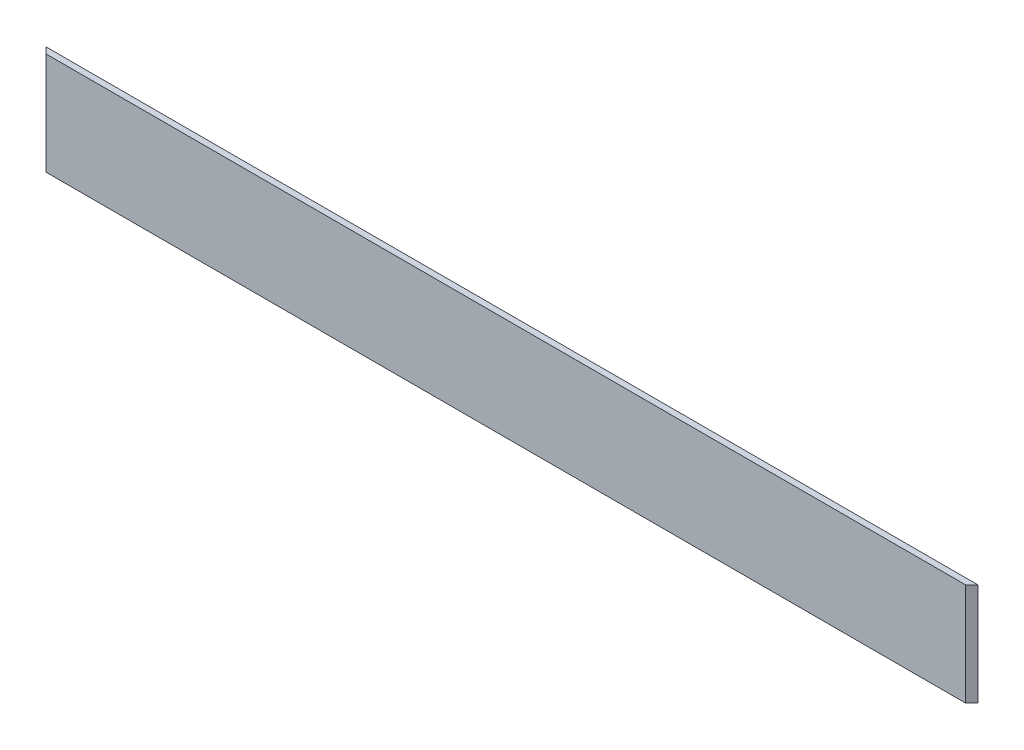
ISO-10303-21;
HEADER;
FILE_DESCRIPTION(('STEP AP214'),'2;1');
FILE_NAME('part.step','',(''),(''),'','','');
FILE_SCHEMA(('AUTOMOTIVE_DESIGN { 1 0 10303 214 1 1 1 1 }'));
ENDSEC;
DATA;
#1=APPLICATION_CONTEXT('core data for automotive mechanical design processes');
#2=APPLICATION_PROTOCOL_DEFINITION('international standard','automotive_design',2000,#1);
#3=PRODUCT_CONTEXT('',#1,'mechanical');
#4=PRODUCT('Part','Part','',(#3));
#5=PRODUCT_RELATED_PRODUCT_CATEGORY('part','',(#4));
#6=PRODUCT_DEFINITION_FORMATION('','',#4);
#7=PRODUCT_DEFINITION_CONTEXT('part definition',#1,'design');
#8=PRODUCT_DEFINITION('design','',#6,#7);
#9=PRODUCT_DEFINITION_SHAPE('','',#8);
#10=(LENGTH_UNIT() NAMED_UNIT(*) SI_UNIT(.MILLI.,.METRE.));
#11=(NAMED_UNIT(*) PLANE_ANGLE_UNIT() SI_UNIT($,.RADIAN.));
#12=(NAMED_UNIT(*) SI_UNIT($,.STERADIAN.) SOLID_ANGLE_UNIT());
#13=UNCERTAINTY_MEASURE_WITH_UNIT(LENGTH_MEASURE(1.E-05),#10,'distance_accuracy_value','');
#14=(GEOMETRIC_REPRESENTATION_CONTEXT(3) GLOBAL_UNCERTAINTY_ASSIGNED_CONTEXT((#13)) GLOBAL_UNIT_ASSIGNED_CONTEXT((#10,
#11,#12)) REPRESENTATION_CONTEXT('',''));
#15=CARTESIAN_POINT('',(0.,0.,0.));
#16=DIRECTION('',(0.,0.,1.));
#17=DIRECTION('',(1.,0.,0.));
#18=AXIS2_PLACEMENT_3D('',#15,#16,#17);
#19=CARTESIAN_POINT('',(227.5,50.,1.49999999999997));
#20=DIRECTION('',(0.,0.,-1.));
#21=DIRECTION('',(-1.,0.,0.));
#22=AXIS2_PLACEMENT_3D('',#19,#20,#21);
#23=PLANE('',#22);
#24=DIRECTION('',(1.,0.,0.));
#25=VECTOR('',#24,1.);
#26=CARTESIAN_POINT('',(227.5,0.,1.49999999999997));
#27=LINE('',#26,#25);
#28=CARTESIAN_POINT('',(-224.5,0.,1.50000000000003));
#29=VERTEX_POINT('',#28);
#30=CARTESIAN_POINT('',(224.5,0.,1.49999999999997));
#31=VERTEX_POINT('',#30);
#32=EDGE_CURVE('E88',#29,#31,#27,.T.);
#33=ORIENTED_EDGE('',*,*,#32,.T.);
#34=DIRECTION('',(0.,1.,0.));
#35=VECTOR('',#34,1.);
#36=CARTESIAN_POINT('',(224.5,0.,1.50000000000003));
#37=LINE('',#36,#35);
#38=CARTESIAN_POINT('',(224.5,50.,1.50000000000003));
#39=VERTEX_POINT('',#38);
#40=EDGE_CURVE('E47',#31,#39,#37,.T.);
#41=ORIENTED_EDGE('',*,*,#40,.T.);
#42=DIRECTION('',(1.,0.,0.));
#43=VECTOR('',#42,1.);
#44=CARTESIAN_POINT('',(227.5,50.,1.49999999999997));
#45=LINE('',#44,#43);
#46=CARTESIAN_POINT('',(-224.5,50.,1.50000000000003));
#47=VERTEX_POINT('',#46);
#48=EDGE_CURVE('E87',#47,#39,#45,.T.);
#49=ORIENTED_EDGE('',*,*,#48,.F.);
#50=DIRECTION('',(0.,1.,0.));
#51=VECTOR('',#50,1.);
#52=CARTESIAN_POINT('',(-224.5,0.,1.50000000000003));
#53=LINE('',#52,#51);
#54=EDGE_CURVE('E92',#29,#47,#53,.T.);
#55=ORIENTED_EDGE('',*,*,#54,.F.);
#56=EDGE_LOOP('',(#33,#41,#49,#55));
#57=FACE_BOUND('',#56,.T.);
#58=ADVANCED_FACE('F33',(#57),#23,.F.);
#59=CARTESIAN_POINT('',(227.5,50.,-1.50000000000003));
#60=DIRECTION('',(0.,0.,1.));
#61=DIRECTION('',(1.,0.,0.));
#62=AXIS2_PLACEMENT_3D('',#59,#60,#61);
#63=PLANE('',#62);
#64=DIRECTION('',(-1.,0.,0.));
#65=VECTOR('',#64,1.);
#66=CARTESIAN_POINT('',(227.5,0.,-1.50000000000003));
#67=LINE('',#66,#65);
#68=CARTESIAN_POINT('',(227.5,0.,-1.50000000000003));
#69=VERTEX_POINT('',#68);
#70=CARTESIAN_POINT('',(-227.5,0.,-1.49999999999997));
#71=VERTEX_POINT('',#70);
#72=EDGE_CURVE('E82',#69,#71,#67,.T.);
#73=ORIENTED_EDGE('',*,*,#72,.T.);
#74=DIRECTION('',(0.,-1.,0.));
#75=VECTOR('',#74,1.);
#76=CARTESIAN_POINT('',(-227.5,50.,-1.49999999999997));
#77=LINE('',#76,#75);
#78=CARTESIAN_POINT('',(-227.5,50.,-1.49999999999997));
#79=VERTEX_POINT('',#78);
#80=EDGE_CURVE('E40',#79,#71,#77,.T.);
#81=ORIENTED_EDGE('',*,*,#80,.F.);
#82=DIRECTION('',(-1.,0.,0.));
#83=VECTOR('',#82,1.);
#84=CARTESIAN_POINT('',(227.5,50.,-1.50000000000003));
#85=LINE('',#84,#83);
#86=CARTESIAN_POINT('',(227.5,50.,-1.50000000000003));
#87=VERTEX_POINT('',#86);
#88=EDGE_CURVE('E84',#87,#79,#85,.T.);
#89=ORIENTED_EDGE('',*,*,#88,.F.);
#90=DIRECTION('',(0.,-1.,0.));
#91=VECTOR('',#90,1.);
#92=CARTESIAN_POINT('',(227.5,50.,-1.50000000000003));
#93=LINE('',#92,#91);
#94=EDGE_CURVE('E11',#87,#69,#93,.T.);
#95=ORIENTED_EDGE('',*,*,#94,.T.);
#96=EDGE_LOOP('',(#73,#81,#89,#95));
#97=FACE_BOUND('',#96,.T.);
#98=ADVANCED_FACE('F81',(#97),#63,.F.);
#99=CARTESIAN_POINT('',(0.,50.,0.));
#100=DIRECTION('',(0.,1.,0.));
#101=DIRECTION('',(0.,0.,1.));
#102=AXIS2_PLACEMENT_3D('',#99,#100,#101);
#103=PLANE('',#102);
#104=DIRECTION('',(-0.707106781186541,0.,0.707106781186554));
#105=VECTOR('',#104,1.);
#106=CARTESIAN_POINT('',(227.5,50.,-1.50000000000003));
#107=LINE('',#106,#105);
#108=EDGE_CURVE('E76',#87,#39,#107,.T.);
#109=ORIENTED_EDGE('',*,*,#108,.F.);
#110=ORIENTED_EDGE('',*,*,#88,.T.);
#111=DIRECTION('',(-0.707106781186545,0.,-0.70710678118655));
#112=VECTOR('',#111,1.);
#113=CARTESIAN_POINT('',(-224.5,50.,1.50000000000003));
#114=LINE('',#113,#112);
#115=EDGE_CURVE('E99',#47,#79,#114,.T.);
#116=ORIENTED_EDGE('',*,*,#115,.F.);
#117=ORIENTED_EDGE('',*,*,#48,.T.);
#118=EDGE_LOOP('',(#109,#110,#116,#117));
#119=FACE_BOUND('',#118,.T.);
#120=ADVANCED_FACE('F106',(#119),#103,.T.);
#121=CARTESIAN_POINT('',(0.,0.,0.));
#122=DIRECTION('',(0.,1.,0.));
#123=DIRECTION('',(0.,0.,1.));
#124=AXIS2_PLACEMENT_3D('',#121,#122,#123);
#125=PLANE('',#124);
#126=ORIENTED_EDGE('',*,*,#72,.F.);
#127=DIRECTION('',(-0.707106781186541,0.,0.707106781186554));
#128=VECTOR('',#127,1.);
#129=CARTESIAN_POINT('',(227.5,0.,-1.50000000000003));
#130=LINE('',#129,#128);
#131=EDGE_CURVE('E69',#69,#31,#130,.T.);
#132=ORIENTED_EDGE('',*,*,#131,.T.);
#133=ORIENTED_EDGE('',*,*,#32,.F.);
#134=DIRECTION('',(-0.707106781186545,0.,-0.70710678118655));
#135=VECTOR('',#134,1.);
#136=CARTESIAN_POINT('',(-224.5,0.,1.50000000000003));
#137=LINE('',#136,#135);
#138=EDGE_CURVE('E86',#29,#71,#137,.T.);
#139=ORIENTED_EDGE('',*,*,#138,.T.);
#140=EDGE_LOOP('',(#126,#132,#133,#139));
#141=FACE_BOUND('',#140,.T.);
#142=ADVANCED_FACE('F85',(#141),#125,.F.);
#143=CARTESIAN_POINT('',(-224.5,0.,1.50000000000003));
#144=DIRECTION('',(0.70710678118655,0.,-0.707106781186545));
#145=DIRECTION('',(-0.707106781186545,0.,-0.70710678118655));
#146=AXIS2_PLACEMENT_3D('',#143,#144,#145);
#147=PLANE('',#146);
#148=ORIENTED_EDGE('',*,*,#115,.T.);
#149=ORIENTED_EDGE('',*,*,#80,.T.);
#150=ORIENTED_EDGE('',*,*,#138,.F.);
#151=ORIENTED_EDGE('',*,*,#54,.T.);
#152=EDGE_LOOP('',(#148,#149,#150,#151));
#153=FACE_BOUND('',#152,.T.);
#154=ADVANCED_FACE('F107',(#153),#147,.F.);
#155=CARTESIAN_POINT('',(227.5,0.,-1.50000000000003));
#156=DIRECTION('',(-0.707106781186554,0.,-0.707106781186541));
#157=DIRECTION('',(-0.707106781186541,0.,0.707106781186554));
#158=AXIS2_PLACEMENT_3D('',#155,#156,#157);
#159=PLANE('',#158);
#160=ORIENTED_EDGE('',*,*,#108,.T.);
#161=ORIENTED_EDGE('',*,*,#40,.F.);
#162=ORIENTED_EDGE('',*,*,#131,.F.);
#163=ORIENTED_EDGE('',*,*,#94,.F.);
#164=EDGE_LOOP('',(#160,#161,#162,#163));
#165=FACE_BOUND('',#164,.T.);
#166=ADVANCED_FACE('F70',(#165),#159,.F.);
#167=CLOSED_SHELL('',(#58,#98,#120,#142,#154,#166));
#168=MANIFOLD_SOLID_BREP('B2',#167);
#169=ADVANCED_BREP_SHAPE_REPRESENTATION('',(#18,#168),#14);
#170=SHAPE_DEFINITION_REPRESENTATION(#9,#169);
ENDSEC;
END-ISO-10303-21;
